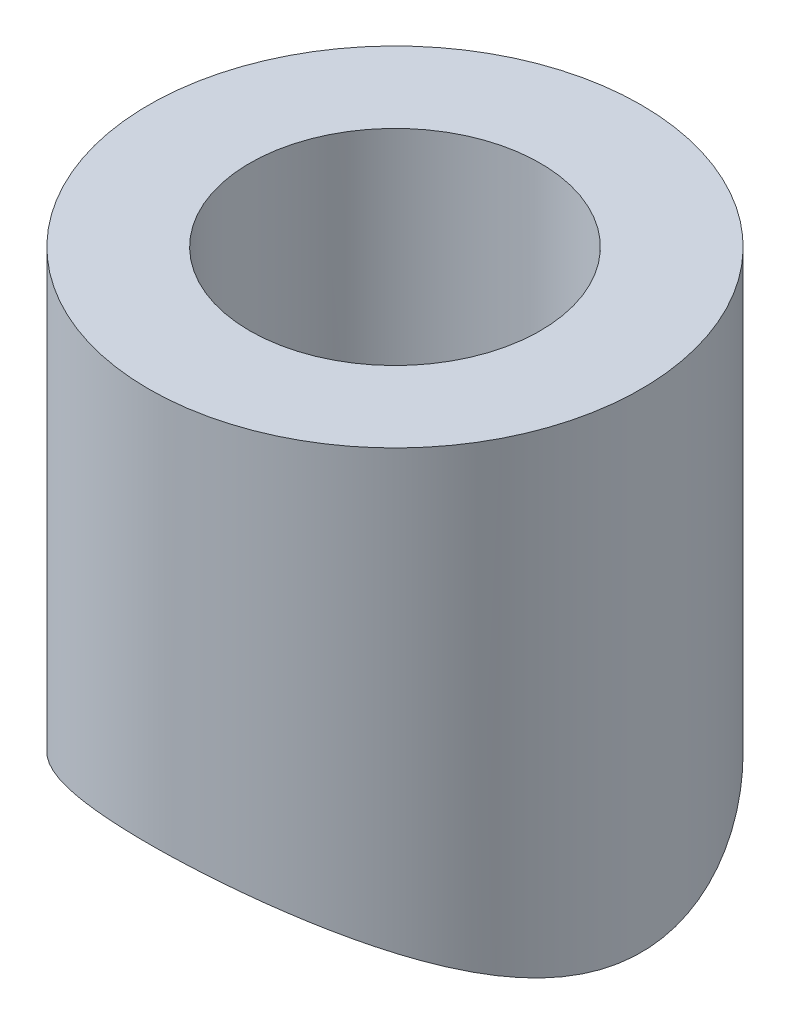
ISO-10303-21;
HEADER;
FILE_DESCRIPTION(('STEP AP214'),'2;1');
FILE_NAME('part.step','',(''),(''),'','','');
FILE_SCHEMA(('AUTOMOTIVE_DESIGN { 1 0 10303 214 1 1 1 1 }'));
ENDSEC;
DATA;
#1=APPLICATION_CONTEXT('core data for automotive mechanical design processes');
#2=APPLICATION_PROTOCOL_DEFINITION('international standard','automotive_design',2000,#1);
#3=PRODUCT_CONTEXT('',#1,'mechanical');
#4=PRODUCT('Part','Part','',(#3));
#5=PRODUCT_RELATED_PRODUCT_CATEGORY('part','',(#4));
#6=PRODUCT_DEFINITION_FORMATION('','',#4);
#7=PRODUCT_DEFINITION_CONTEXT('part definition',#1,'design');
#8=PRODUCT_DEFINITION('design','',#6,#7);
#9=PRODUCT_DEFINITION_SHAPE('','',#8);
#10=(LENGTH_UNIT() NAMED_UNIT(*) SI_UNIT(.MILLI.,.METRE.));
#11=(NAMED_UNIT(*) PLANE_ANGLE_UNIT() SI_UNIT($,.RADIAN.));
#12=(NAMED_UNIT(*) SI_UNIT($,.STERADIAN.) SOLID_ANGLE_UNIT());
#13=UNCERTAINTY_MEASURE_WITH_UNIT(LENGTH_MEASURE(1.E-05),#10,'distance_accuracy_value','');
#14=(GEOMETRIC_REPRESENTATION_CONTEXT(3) GLOBAL_UNCERTAINTY_ASSIGNED_CONTEXT((#13)) GLOBAL_UNIT_ASSIGNED_CONTEXT((#10,
#11,#12)) REPRESENTATION_CONTEXT('',''));
#15=CARTESIAN_POINT('',(0.,0.,0.));
#16=DIRECTION('',(0.,0.,1.));
#17=DIRECTION('',(1.,0.,0.));
#18=AXIS2_PLACEMENT_3D('',#15,#16,#17);
#19=CARTESIAN_POINT('',(0.,20.,0.));
#20=DIRECTION('',(0.,-1.,0.));
#21=DIRECTION('',(0.,0.,-1.));
#22=AXIS2_PLACEMENT_3D('',#19,#20,#21);
#23=CYLINDRICAL_SURFACE('',#22,10.);
#24=CARTESIAN_POINT('',(0.,20.,0.));
#25=DIRECTION('',(0.,1.,0.));
#26=DIRECTION('',(0.,0.,1.));
#27=AXIS2_PLACEMENT_3D('',#24,#25,#26);
#28=CIRCLE('',#27,10.);
#29=CARTESIAN_POINT('',(0.,20.,10.));
#30=VERTEX_POINT('',#29);
#31=EDGE_CURVE('E54',#30,#30,#28,.T.);
#32=ORIENTED_EDGE('',*,*,#31,.F.);
#33=EDGE_LOOP('',(#32));
#34=FACE_BOUND('',#33,.T.);
#35=CARTESIAN_POINT('',(0.,4.,-10.));
#36=CARTESIAN_POINT('',(0.25121602505803,3.99999993303551,-9.99999993534951));
#37=CARTESIAN_POINT('',(0.50243329641179,3.9936756382587,-9.99052094502158));
#38=CARTESIAN_POINT('',(1.00281430621742,3.96853772549104,-9.95275435405694));
#39=CARTESIAN_POINT('',(1.25197803385393,3.94972404176501,-9.92446665442466));
#40=CARTESIAN_POINT('',(1.74639437147615,3.90006260729804,-9.84950014434954));
#41=CARTESIAN_POINT('',(1.99164541802644,3.86921016554187,-9.80281416477334));
#42=CARTESIAN_POINT('',(2.47636835109205,3.7962049328406,-9.69171976038695));
#43=CARTESIAN_POINT('',(2.71584016768893,3.75405200525427,-9.62731112128079));
#44=CARTESIAN_POINT('',(3.18634157579506,3.65962256787353,-9.48196024055735));
#45=CARTESIAN_POINT('',(3.41740603302261,3.60739538358416,-9.40109845501636));
#46=CARTESIAN_POINT('',(3.87103535608821,3.49378366671374,-9.22357931716256));
#47=CARTESIAN_POINT('',(4.09360026589291,3.43239918150983,-9.12692204657064));
#48=CARTESIAN_POINT('',(4.52919238259836,3.30168244543471,-8.91878234381083));
#49=CARTESIAN_POINT('',(4.74222111188152,3.2323514695008,-8.80730228935662));
#50=CARTESIAN_POINT('',(5.15806897823306,3.08697507872304,-8.57039192321527));
#51=CARTESIAN_POINT('',(5.36088427435106,3.01092716702556,-8.44495641940083));
#52=CARTESIAN_POINT('',(5.77229179252596,2.846795493068,-8.16988010712301));
#53=CARTESIAN_POINT('',(5.97992610161555,2.75823764309107,-8.01908981242674));
#54=CARTESIAN_POINT('',(6.38186231730968,2.57646899703334,-7.70306611819707));
#55=CARTESIAN_POINT('',(6.57615840484502,2.48325620038876,-7.5378264854341));
#56=CARTESIAN_POINT('',(6.95109161684714,2.29385168898652,-7.19355182648485));
#57=CARTESIAN_POINT('',(7.13171020600086,2.19765617229715,-7.01449872097467));
#58=CARTESIAN_POINT('',(7.47849345473134,2.00428934694723,-6.6435373382512));
#59=CARTESIAN_POINT('',(7.64466276695229,1.90711836371115,-6.45163323453413));
#60=CARTESIAN_POINT('',(7.98727084465364,1.69841833217074,-6.02411381532355));
#61=CARTESIAN_POINT('',(8.16117931320375,1.58704827439665,-5.78638467561562));
#62=CARTESIAN_POINT('',(8.48824389065339,1.36884696096218,-5.29498288365453));
#63=CARTESIAN_POINT('',(8.64139528736315,1.26201673968374,-5.04130663021886));
#64=CARTESIAN_POINT('',(8.92554542356295,1.05675366786715,-4.51916377060268));
#65=CARTESIAN_POINT('',(9.05657983313836,0.958307425286978,-4.25072192372749));
#66=CARTESIAN_POINT('',(9.2953668655437,0.773655248942557,-3.6995014922921));
#67=CARTESIAN_POINT('',(9.4031186480483,0.68744975701457,-3.41672239072096));
#68=CARTESIAN_POINT('',(9.56603073076105,0.554164407183983,-2.92197512669334));
#69=CARTESIAN_POINT('',(9.62739262612926,0.502974785729807,-2.71313958691548));
#70=CARTESIAN_POINT('',(9.73672940324514,0.410575310927276,-2.28993727422301));
#71=CARTESIAN_POINT('',(9.784712881697,0.369359051155758,-2.07557415043356));
#72=CARTESIAN_POINT('',(9.86663115695275,0.298342143549268,-1.6425809785492));
#73=CARTESIAN_POINT('',(9.90058335814109,0.268527356786831,-1.42395657095979));
#74=CARTESIAN_POINT('',(9.95398099415626,0.221387591900997,-0.983588730911829));
#75=CARTESIAN_POINT('',(9.97342634948116,0.204062682225945,-0.761845281366754));
#76=CARTESIAN_POINT('',(9.99750949727822,0.182578902774177,-0.315986902566632));
#77=CARTESIAN_POINT('',(10.0020856379335,0.178474850878617,-0.0918659554353692));
#78=CARTESIAN_POINT('',(9.9961699136916,0.183765084434493,0.356015329671867));
#79=CARTESIAN_POINT('',(9.98567799761094,0.193159415737438,0.57977566642033));
#80=CARTESIAN_POINT('',(9.94981025476011,0.225054342925366,1.02531254772308));
#81=CARTESIAN_POINT('',(9.92442336863968,0.247564677211397,1.24708749379653));
#82=CARTESIAN_POINT('',(9.85920094420808,0.304779082616557,1.68688746328601));
#83=CARTESIAN_POINT('',(9.81936513033175,0.339483386294636,1.90491241510033));
#84=CARTESIAN_POINT('',(9.72793320006853,0.418001909451414,2.32630776900133));
#85=CARTESIAN_POINT('',(9.67693962238987,0.461341759139342,2.52989845513065));
#86=CARTESIAN_POINT('',(9.56290804839144,0.556656885733759,2.93162712247606));
#87=CARTESIAN_POINT('',(9.49986594811239,0.608635104246266,3.12976321936933));
#88=CARTESIAN_POINT('',(9.29354494113033,0.775450261944478,3.7149653297061));
#89=CARTESIAN_POINT('',(9.13302364641689,0.901210450348814,4.09304089571523));
#90=CARTESIAN_POINT('',(8.84272153741117,1.11712851273462,4.67614375859801));
#91=CARTESIAN_POINT('',(8.72612786560377,1.2015387549069,4.89016265101236));
#92=CARTESIAN_POINT('',(8.47852404512044,1.37487173625424,5.30787405322557));
#93=CARTESIAN_POINT('',(8.34751253601214,1.46379490083046,5.51156558590632));
#94=CARTESIAN_POINT('',(8.07152743445186,1.6442740511078,5.90837865949047));
#95=CARTESIAN_POINT('',(7.92653854045352,1.73583284345222,6.10148824490793));
#96=CARTESIAN_POINT('',(7.62317723911379,1.91969948733064,6.47652189877409));
#97=CARTESIAN_POINT('',(7.46480412146615,2.01200737838432,6.658445372685));
#98=CARTESIAN_POINT('',(7.09947419488299,2.21552488661668,7.04865159805946));
#99=CARTESIAN_POINT('',(6.88940798266188,2.32651519777505,7.25415168380683));
#100=CARTESIAN_POINT('',(6.45073383646428,2.54429826686849,7.64687567157477));
#101=CARTESIAN_POINT('',(6.22212250338513,2.65109024994987,7.83409620924893));
#102=CARTESIAN_POINT('',(5.74734305844846,2.85767006749272,8.18875916118422));
#103=CARTESIAN_POINT('',(5.50118802469018,2.95746301158379,8.35621606611875));
#104=CARTESIAN_POINT('',(4.99223677264768,3.14748381365506,8.6698826076979));
#105=CARTESIAN_POINT('',(4.72944516189957,3.23771430162669,8.81609809055921));
#106=CARTESIAN_POINT('',(4.24166531219499,3.38958461571668,9.05909913410104));
#107=CARTESIAN_POINT('',(4.01936273392654,3.45336194634127,9.15995597951621));
#108=CARTESIAN_POINT('',(3.5659086899693,3.57186255644632,9.34581764481726));
#109=CARTESIAN_POINT('',(3.3347588978084,3.62658753793695,9.43082544500166));
#110=CARTESIAN_POINT('',(2.86496136705682,3.72581387463809,9.58399689634911));
#111=CARTESIAN_POINT('',(2.6263185086893,3.77032173343263,9.65217126472845));
#112=CARTESIAN_POINT('',(2.14287716114343,3.8481652748998,9.7708761960258));
#113=CARTESIAN_POINT('',(1.89807857733481,3.88150078570999,9.82140648752831));
#114=CARTESIAN_POINT('',(1.40298657198256,3.93632894740972,9.90428665687823));
#115=CARTESIAN_POINT('',(1.15267379959939,3.95776916030985,9.9365560475488));
#116=CARTESIAN_POINT('',(0.649559957245918,3.98804780109095,9.98207727619356));
#117=CARTESIAN_POINT('',(0.396758884024645,3.99688621250542,9.99532908931791));
#118=CARTESIAN_POINT('',(-0.10923236811486,4.00173589757922,10.0026040164575));
#119=CARTESIAN_POINT('',(-0.36242253056564,3.99774769992631,9.99662792300954));
#120=CARTESIAN_POINT('',(-0.86709078423296,3.97704666149022,9.96554372761836));
#121=CARTESIAN_POINT('',(-1.11856894805903,3.96033436379857,9.94043644223491));
#122=CARTESIAN_POINT('',(-1.60021088099168,3.91622072567469,9.8739156350187));
#123=CARTESIAN_POINT('',(-1.83062905444838,3.88965450331535,9.83377417424126));
#124=CARTESIAN_POINT('',(-2.286750791688,3.82645532288706,9.73781705393653));
#125=CARTESIAN_POINT('',(-2.51245462006972,3.78982293143753,9.6820022766482));
#126=CARTESIAN_POINT('',(-2.95782054801539,3.70722928723845,9.55535953808213));
#127=CARTESIAN_POINT('',(-3.17748326843354,3.66126899723065,9.48453312613683));
#128=CARTESIAN_POINT('',(-3.609760336539,3.56086857449814,9.3285826248577));
#129=CARTESIAN_POINT('',(-3.82237190283185,3.50642514265643,9.24345297194153));
#130=CARTESIAN_POINT('',(-4.25209030381565,3.38653644685778,9.05417659982018));
#131=CARTESIAN_POINT('',(-4.4686990221519,3.32062655384653,8.94919430778672));
#132=CARTESIAN_POINT('',(-4.89208194000024,3.18158002382276,8.72496139473395));
#133=CARTESIAN_POINT('',(-5.0988519722715,3.10844036425447,8.60570480161194));
#134=CARTESIAN_POINT('',(-5.50184549515242,2.95622092378315,8.35381209040239));
#135=CARTESIAN_POINT('',(-5.69806630986326,2.87713964782103,8.2211726019456));
#136=CARTESIAN_POINT('',(-6.07939950359023,2.71436808581636,7.94333478354166));
#137=CARTESIAN_POINT('',(-6.26451064052812,2.63067728642082,7.79813505375508));
#138=CARTESIAN_POINT('',(-6.65160325692351,2.44652690823113,7.47194619721016));
#139=CARTESIAN_POINT('',(-6.85161533719512,2.34551033202061,7.28893046890855));
#140=CARTESIAN_POINT('',(-7.23554778501399,2.14131347092371,6.90796479617464));
#141=CARTESIAN_POINT('',(-7.41947156934853,2.03813365125963,6.71001803946436));
#142=CARTESIAN_POINT('',(-7.77089399542675,1.83178699091403,6.29970117597319));
#143=CARTESIAN_POINT('',(-7.93837850837233,1.72862023620127,6.08731892329163));
#144=CARTESIAN_POINT('',(-8.25611378856013,1.52486307300481,5.64888230394208));
#145=CARTESIAN_POINT('',(-8.406366316081,1.42427240218627,5.42282933737188));
#146=CARTESIAN_POINT('',(-8.67693135617692,1.23665115187757,4.97724137462276));
#147=CARTESIAN_POINT('',(-8.798701217252,1.14919318294131,4.75877148537544));
#148=CARTESIAN_POINT('',(-9.02642731767801,0.980970362239639,4.31122260025005));
#149=CARTESIAN_POINT('',(-9.13238332794099,0.900205607443256,4.08214345074349));
#150=CARTESIAN_POINT('',(-9.32741855584938,0.747959531107767,3.61433071357679));
#151=CARTESIAN_POINT('',(-9.4165224648861,0.676464676577637,3.37561188246709));
#152=CARTESIAN_POINT('',(-9.57697422267288,0.545229567701584,2.88913740218876));
#153=CARTESIAN_POINT('',(-9.64832615207156,0.48548661260812,2.64138384487466));
#154=CARTESIAN_POINT('',(-9.76102279918068,0.389770483143118,2.18348283637983));
#155=CARTESIAN_POINT('',(-9.80545611371607,0.35145489156227,1.97458281771767));
#156=CARTESIAN_POINT('',(-9.88104071134551,0.285723439317099,1.55271682450731));
#157=CARTESIAN_POINT('',(-9.91219468486488,0.258305370865387,1.33975168270624));
#158=CARTESIAN_POINT('',(-9.96072687389686,0.21539011314292,0.911245598990397));
#159=CARTESIAN_POINT('',(-9.97811721936676,0.19988242754709,0.695707095456911));
#160=CARTESIAN_POINT('',(-9.99887192737887,0.18135758848689,0.26340949324988));
#161=CARTESIAN_POINT('',(-10.0022360852241,0.178340617310944,0.046650376809043));
#162=CARTESIAN_POINT('',(-9.99487528285886,0.184922492776818,-0.386557642145756));
#163=CARTESIAN_POINT('',(-9.98414227971974,0.194528541299066,-0.603006296976088));
#164=CARTESIAN_POINT('',(-9.94876260555887,0.22598222127615,-1.03385131272256));
#165=CARTESIAN_POINT('',(-9.92411604859886,0.247829752376686,-1.24824769044838));
#166=CARTESIAN_POINT('',(-9.86128176273312,0.302958114871752,-1.67374366731717));
#167=CARTESIAN_POINT('',(-9.82308162817279,0.336249419934558,-1.88484006053562));
#168=CARTESIAN_POINT('',(-9.73367199559206,0.413110740350625,-2.30244876806635));
#169=CARTESIAN_POINT('',(-9.68245505594956,0.456686634315685,-2.50895838646712));
#170=CARTESIAN_POINT('',(-9.55234495109753,0.565538826753452,-2.97060688179122));
#171=CARTESIAN_POINT('',(-9.46971376976683,0.633504015642252,-3.22406270379323));
#172=CARTESIAN_POINT('',(-9.28581809630263,0.780808368451346,-3.72072127097187));
#173=CARTESIAN_POINT('',(-9.18454717174898,0.86015145669565,-3.96392044094322));
#174=CARTESIAN_POINT('',(-8.96438401317387,1.02742474627637,-4.43942989824263));
#175=CARTESIAN_POINT('',(-8.84547355124955,1.1153637978473,-4.67172859070883));
#176=CARTESIAN_POINT('',(-8.59104253624864,1.29709012912716,-5.12459249071148));
#177=CARTESIAN_POINT('',(-8.45552286037769,1.39087709985336,-5.34515831703064));
#178=CARTESIAN_POINT('',(-8.16602291524329,1.58359437791119,-5.7779814169915));
#179=CARTESIAN_POINT('',(-8.01175463180858,1.68258683037286,-5.99001811350071));
#180=CARTESIAN_POINT('',(-7.68731964794005,1.88182332846335,-6.40107008606171));
#181=CARTESIAN_POINT('',(-7.51714699045039,1.98206783077517,-6.60008043519651));
#182=CARTESIAN_POINT('',(-7.16144037138928,2.18162978751133,-6.98443549509661));
#183=CARTESIAN_POINT('',(-6.97590419669871,2.28094710607369,-7.16977822974279));
#184=CARTESIAN_POINT('',(-6.58999024940345,2.47660337742725,-7.5260207576439));
#185=CARTESIAN_POINT('',(-6.38961262683214,2.57294236031274,-7.69692069686481));
#186=CARTESIAN_POINT('',(-5.94464767383283,2.77421637055963,-8.04688641781006));
#187=CARTESIAN_POINT('',(-5.69784749774642,2.87839392663557,-8.22358940998542));
#188=CARTESIAN_POINT('',(-5.18647351593625,3.07749196651132,-8.55531270154688));
#189=CARTESIAN_POINT('',(-4.92189712727176,3.17241110009859,-8.71032983977895));
#190=CARTESIAN_POINT('',(-4.37672916893082,3.3501334769257,-8.99660521889808));
#191=CARTESIAN_POINT('',(-4.09615781925748,3.43295156539963,-9.12789261847726));
#192=CARTESIAN_POINT('',(-3.52068543509657,3.58400380388435,-9.36490865379198));
#193=CARTESIAN_POINT('',(-3.22578947664134,3.65224307439965,-9.47064626507089));
#194=CARTESIAN_POINT('',(-2.69111020627909,3.7585526216257,-9.63420014250047));
#195=CARTESIAN_POINT('',(-2.45363501782301,3.79995729353856,-9.69744389486791));
#196=CARTESIAN_POINT('',(-1.97308581148122,3.87164769700839,-9.8065080818939));
#197=CARTESIAN_POINT('',(-1.73001287618556,3.90193555965206,-9.85233185601367));
#198=CARTESIAN_POINT('',(-1.24011776126904,3.95067444418079,-9.92589668010659));
#199=CARTESIAN_POINT('',(-0.993297927604442,3.96913258326322,-9.95364860293288));
#200=CARTESIAN_POINT('',(-0.497652520116127,3.99379562414303,-9.9907006409564));
#201=CARTESIAN_POINT('',(-0.248826871409575,4.00000006632763,-10.0000000640356));
#202=CARTESIAN_POINT('',(0.,4.,-10.));
#203=B_SPLINE_CURVE_WITH_KNOTS('',3,(#35,#36,#37,#38,#39,#40,#41,#42,#43,#44,#45,#46,#47,#48,
#49,#50,#51,#52,#53,#54,#55,#56,#57,#58,#59,#60,#61,#62,#63,#64,#65,#66,#67,#68,#69,#70,#71,#72,
#73,#74,#75,#76,#77,#78,#79,#80,#81,#82,#83,#84,#85,#86,#87,#88,#89,#90,#91,#92,#93,#94,#95,#96,
#97,#98,#99,#100,#101,#102,#103,#104,#105,#106,#107,#108,#109,#110,#111,#112,#113,#114,#115,
#116,#117,#118,#119,#120,#121,#122,#123,#124,#125,#126,#127,#128,#129,#130,#131,#132,#133,#134,
#135,#136,#137,#138,#139,#140,#141,#142,#143,#144,#145,#146,#147,#148,#149,#150,#151,#152,#153,
#154,#155,#156,#157,#158,#159,#160,#161,#162,#163,#164,#165,#166,#167,#168,#169,#170,#171,#172,
#173,#174,#175,#176,#177,#178,#179,#180,#181,#182,#183,#184,#185,#186,#187,#188,#189,#190,#191,
#192,#193,#194,#195,#196,#197,#198,#199,#200,#201,#202),.UNSPECIFIED.,.T.,.F.,(4,2,2,2,2,2,2,2,
2,2,2,2,2,2,2,2,2,2,2,2,2,2,2,2,2,2,2,2,2,2,2,2,2,2,2,2,2,2,2,2,2,2,2,2,2,2,2,2,2,2,2,2,2,2,2,2,
2,2,2,2,2,2,2,2,2,2,2,2,2,2,2,2,2,2,2,2,2,2,2,2,2,2,2,4),(0.,0.753394300185717,1.50679256573076,
2.2604846936234,3.0141859352887,3.76428651453101,4.51438321311105,5.26435973397233,
6.01461622276406,6.82821436912434,7.64216523759396,8.45720010773051,9.27197155852477,
10.2155659725767,11.159374240242,12.1016454881405,13.0439507391687,13.7141436311146,
14.3839048726875,15.0528328312319,15.7217644556782,16.3934661372619,17.0651701004973,
17.7373734287591,18.4095895777342,19.0518780381327,19.694385665547,20.9787317460437,
21.7519790573574,22.5252993930816,23.2994761376386,24.0736939939054,25.0149715434142,
25.956422009544,26.8971778596539,27.8376742956463,28.5938374823541,29.3498583343056,
30.1053966077373,30.8609465029599,31.6198011453589,32.3786567793353,33.1374811351664,
33.896273104583,34.6016588818499,35.3070049614494,36.0122782785612,36.7178265661456,
37.4657892549015,38.2140659784521,38.9625316217945,39.7110807894034,40.5781485096025,
41.4450316350127,42.3126534000335,43.1801864568224,43.9743636862577,44.7685524194551,
45.5615683509502,46.3544018230503,47.0046896349387,47.6548456343111,48.3044280077778,
48.9540198611609,49.6039824906945,50.2539397919853,50.9044935435747,51.5554200523821,
52.3795636043219,53.203992096394,54.0292785280237,54.8545213914148,55.6945962643172,
56.534987061841,57.3754991292032,58.2160027009215,59.1774341078251,60.1390055171883,
61.0993872102032,62.0594310326874,62.8062251677098,63.5528760678118,64.2990773324883,
65.045306585219),.UNSPECIFIED.);
#204=CARTESIAN_POINT('',(0.,4.,-10.));
#205=VERTEX_POINT('',#204);
#206=EDGE_CURVE('E10',#205,#205,#203,.T.);
#207=ORIENTED_EDGE('',*,*,#206,.F.);
#208=EDGE_LOOP('',(#207));
#209=FACE_BOUND('',#208,.T.);
#210=ADVANCED_FACE('F40',(#34,#209),#23,.T.);
#211=CARTESIAN_POINT('',(0.,20.,0.));
#212=DIRECTION('',(0.,1.,0.));
#213=DIRECTION('',(0.,0.,1.));
#214=AXIS2_PLACEMENT_3D('',#211,#212,#213);
#215=PLANE('',#214);
#216=CARTESIAN_POINT('',(0.,20.,0.));
#217=DIRECTION('',(0.,1.,0.));
#218=DIRECTION('',(0.,0.,1.));
#219=AXIS2_PLACEMENT_3D('',#216,#217,#218);
#220=CIRCLE('',#219,5.89999999999999);
#221=CARTESIAN_POINT('',(0.,20.,5.89999999999999));
#222=VERTEX_POINT('',#221);
#223=EDGE_CURVE('E82',#222,#222,#220,.T.);
#224=ORIENTED_EDGE('',*,*,#223,.F.);
#225=EDGE_LOOP('',(#224));
#226=FACE_BOUND('',#225,.T.);
#227=ORIENTED_EDGE('',*,*,#31,.T.);
#228=EDGE_LOOP('',(#227));
#229=FACE_BOUND('',#228,.T.);
#230=ADVANCED_FACE('F68',(#226,#229),#215,.T.);
#231=CARTESIAN_POINT('',(0.,-11.,10.));
#232=DIRECTION('',(0.,0.,-1.));
#233=DIRECTION('',(-1.,0.,0.));
#234=AXIS2_PLACEMENT_3D('',#231,#232,#233);
#235=CYLINDRICAL_SURFACE('',#234,15.);
#236=CARTESIAN_POINT('',(0.,4.,5.89999999999999));
#237=CARTESIAN_POINT('',(-0.15886402470859,3.99999913625232,5.8999988863144));
#238=CARTESIAN_POINT('',(-0.317779950355858,3.99746931305863,5.89357520474754));
#239=CARTESIAN_POINT('',(-0.634487192558133,3.9874133333307,5.86793776395059));
#240=CARTESIAN_POINT('',(-0.792277747875371,3.97988406911607,5.84871604937163));
#241=CARTESIAN_POINT('',(-1.10582108289662,3.96000940030454,5.79762332906444));
#242=CARTESIAN_POINT('',(-1.26156911964243,3.94765432860217,5.76572693104519));
#243=CARTESIAN_POINT('',(-1.56964700780746,3.9184504600687,5.68958691217239));
#244=CARTESIAN_POINT('',(-1.72197544560173,3.90159984060818,5.64533828301715));
#245=CARTESIAN_POINT('',(-2.02158668581309,3.86391280156689,5.54509257957201));
#246=CARTESIAN_POINT('',(-2.16888563475883,3.84309090394318,5.48913824002966));
#247=CARTESIAN_POINT('',(-2.45813869164274,3.79793886714942,5.36584429748198));
#248=CARTESIAN_POINT('',(-2.60009078044859,3.77360741909241,5.29850044513351));
#249=CARTESIAN_POINT('',(-2.87766944043755,3.72205570263508,5.15301346366749));
#250=CARTESIAN_POINT('',(-3.01330054724605,3.69483755300188,5.07487824258846));
#251=CARTESIAN_POINT('',(-3.27762075907118,3.63815256297203,4.90832310456473));
#252=CARTESIAN_POINT('',(-3.40630732890181,3.6086849107206,4.8198994683958));
#253=CARTESIAN_POINT('',(-3.79122224674704,3.51544087743521,4.53231426875867));
#254=CARTESIAN_POINT('',(-4.03487542005891,3.44902511642504,4.31681064559096));
#255=CARTESIAN_POINT('',(-4.48363241461597,3.31614521950365,3.84866694646856));
#256=CARTESIAN_POINT('',(-4.68871849815152,3.24968107537836,3.59600987769273));
#257=CARTESIAN_POINT('',(-4.96750285069997,3.15394446782774,3.18789782875035));
#258=CARTESIAN_POINT('',(-5.05714283824389,3.12208150221224,3.04371452529704));
#259=CARTESIAN_POINT('',(-5.22387669173731,3.06125821169838,2.74771340313458));
#260=CARTESIAN_POINT('',(-5.30097570422339,3.03229669799253,2.59589874981333));
#261=CARTESIAN_POINT('',(-5.44197901115005,2.97821782892189,2.28558913674227));
#262=CARTESIAN_POINT('',(-5.50588224456501,2.95310078271902,2.12709364104254));
#263=CARTESIAN_POINT('',(-5.61983836008169,2.90759448914051,1.80461604333882));
#264=CARTESIAN_POINT('',(-5.66989811023419,2.88720289818108,1.6406367074143));
#265=CARTESIAN_POINT('',(-5.75377705769864,2.85265380017551,1.31566197136275));
#266=CARTESIAN_POINT('',(-5.78821121044726,2.8382624894147,1.15485012917211));
#267=CARTESIAN_POINT('',(-5.84355691082952,2.81498271579644,0.830589464875498));
#268=CARTESIAN_POINT('',(-5.86447451170366,2.80609178972773,0.667141856829423));
#269=CARTESIAN_POINT('',(-5.89256180921693,2.79412735701231,0.338888435645067));
#270=CARTESIAN_POINT('',(-5.89973418068685,2.79105271851367,0.174082893032172));
#271=CARTESIAN_POINT('',(-5.90025126583926,2.79083161646126,-0.155550163954016));
#272=CARTESIAN_POINT('',(-5.89359659374709,2.79368488957762,-0.320377677026099));
#273=CARTESIAN_POINT('',(-5.86745354897625,2.80482415567381,-0.637652170168301));
#274=CARTESIAN_POINT('',(-5.84885735830678,2.81273230955767,-0.790186996663247));
#275=CARTESIAN_POINT('',(-5.79989039834442,2.8333646248671,-1.09307498826591));
#276=CARTESIAN_POINT('',(-5.76951574408652,2.84609037527806,-1.24342741654671));
#277=CARTESIAN_POINT('',(-5.69729551133463,2.87596293312977,-1.5408569857585));
#278=CARTESIAN_POINT('',(-5.65545274779607,2.89310865558548,-1.68793492087812));
#279=CARTESIAN_POINT('',(-5.56064974739785,2.93132386008433,-1.97799535969655));
#280=CARTESIAN_POINT('',(-5.50768524337297,2.95239484781353,-2.12097626745802));
#281=CARTESIAN_POINT('',(-5.38993241709986,2.99831052320604,-2.40472127782506));
#282=CARTESIAN_POINT('',(-5.32493240680503,3.0232211678615,-2.54538677220291));
#283=CARTESIAN_POINT('',(-5.18429832328865,3.07581919764985,-2.82081015539261));
#284=CARTESIAN_POINT('',(-5.10866064550753,3.10350752308067,-2.95556602134616));
#285=CARTESIAN_POINT('',(-4.94726662477955,3.16092819984799,-3.21843808743218));
#286=CARTESIAN_POINT('',(-4.86150898415206,3.19066081311863,-3.34655343301407));
#287=CARTESIAN_POINT('',(-4.68039973214116,3.25142030010385,-3.595490794026));
#288=CARTESIAN_POINT('',(-4.58504764237444,3.28244723830882,-3.71631244530831));
#289=CARTESIAN_POINT('',(-4.3778024297688,3.34738648969097,-3.95880647418091));
#290=CARTESIAN_POINT('',(-4.26520560660479,3.38134108601129,-4.07986701444259));
#291=CARTESIAN_POINT('',(-4.03024679024003,3.44894627875407,-4.31212139911646));
#292=CARTESIAN_POINT('',(-3.90788770986757,3.48259696254562,-4.4233181658894));
#293=CARTESIAN_POINT('',(-3.65400475228751,3.54872719593226,-4.63525690958083));
#294=CARTESIAN_POINT('',(-3.52247574699305,3.58120607456291,-4.73599295689648));
#295=CARTESIAN_POINT('',(-3.2511304652065,3.64409561571205,-4.92621480773481));
#296=CARTESIAN_POINT('',(-3.11131753045877,3.67450710172957,-5.01570510294469));
#297=CARTESIAN_POINT('',(-2.82145635598018,3.73301237186477,-5.18440293141563));
#298=CARTESIAN_POINT('',(-2.67126392162488,3.76105100238213,-5.26338223976571));
#299=CARTESIAN_POINT('',(-2.36414612855485,3.81334071806329,-5.40829268185492));
#300=CARTESIAN_POINT('',(-2.2072234993306,3.83759332051084,-5.47422904551266));
#301=CARTESIAN_POINT('',(-1.8877337615166,3.88161469515253,-5.59244728656685));
#302=CARTESIAN_POINT('',(-1.72516770706421,3.90138429958614,-5.64473169863293));
#303=CARTESIAN_POINT('',(-1.39561339752138,3.93585292671384,-5.7351068458267));
#304=CARTESIAN_POINT('',(-1.2286254379793,3.95055228737306,-5.77319852700692));
#305=CARTESIAN_POINT('',(-0.901300765008888,3.97374400142506,-5.83298565897697));
#306=CARTESIAN_POINT('',(-0.74113496353724,3.98254510868229,-5.8554991514441));
#307=CARTESIAN_POINT('',(-0.419299518258383,3.99500302010952,-5.88730255061081));
#308=CARTESIAN_POINT('',(-0.257629945792265,3.99866006708086,-5.8965930814388));
#309=CARTESIAN_POINT('',(0.0659239641503538,4.00072740695533,-5.90184956228925));
#310=CARTESIAN_POINT('',(0.227808248681544,3.99913881476464,-5.89781834371118));
#311=CARTESIAN_POINT('',(0.550561760634162,3.99076182076037,-5.87648164094379));
#312=CARTESIAN_POINT('',(0.711431006321447,3.98397351278749,-5.85917639631444));
#313=CARTESIAN_POINT('',(1.02398174081835,3.96579092992752,-5.81251548539859));
#314=CARTESIAN_POINT('',(1.17575901931427,3.95460928804992,-5.78371526686284));
#315=CARTESIAN_POINT('',(1.47627933170729,3.92793900669011,-5.71440164797086));
#316=CARTESIAN_POINT('',(1.62502135378546,3.91244895536182,-5.67388440782705));
#317=CARTESIAN_POINT('',(1.91841980360293,3.87754978203588,-5.58151539700504));
#318=CARTESIAN_POINT('',(2.06307734676172,3.85814174202432,-5.5296667552645));
#319=CARTESIAN_POINT('',(2.3475293157707,3.81586285583965,-5.41503739209104));
#320=CARTESIAN_POINT('',(2.48732186831017,3.79299069352603,-5.35225251423529));
#321=CARTESIAN_POINT('',(2.76529996156236,3.74359647040171,-5.21420312979319));
#322=CARTESIAN_POINT('',(2.90331206301826,3.71698563094202,-5.13862125080068));
#323=CARTESIAN_POINT('',(3.1725479442987,3.66130440058902,-4.9769076615116));
#324=CARTESIAN_POINT('',(3.30376937428445,3.63223316735334,-4.89077233357272));
#325=CARTESIAN_POINT('',(3.55869694740015,3.57233079081368,-4.70852743178479));
#326=CARTESIAN_POINT('',(3.68240185604492,3.54149936002558,-4.61241622651734));
#327=CARTESIAN_POINT('',(3.92163712638682,3.47881406272616,-4.41080887063424));
#328=CARTESIAN_POINT('',(4.03716714736857,3.44696015368001,-4.30531232926693));
#329=CARTESIAN_POINT('',(4.26658437816332,3.3809389304766,-4.07847027669607));
#330=CARTESIAN_POINT('',(4.37989143866896,3.34675422530451,-3.9565422899972));
#331=CARTESIAN_POINT('',(4.5958488917381,3.2790398339185,-3.70348940204712));
#332=CARTESIAN_POINT('',(4.69850261993577,3.24550994536247,-3.5723674011849));
#333=CARTESIAN_POINT('',(4.89258424450002,3.18002527887828,-3.3015727183022));
#334=CARTESIAN_POINT('',(4.98400592990807,3.14807137821386,-3.16189536884691));
#335=CARTESIAN_POINT('',(5.15486352372169,3.08671791093294,-2.87493543946249));
#336=CARTESIAN_POINT('',(5.23430447280632,3.05731727229825,-2.7276560931417));
#337=CARTESIAN_POINT('',(5.38123297728264,3.00173412247333,-2.42504869838527));
#338=CARTESIAN_POINT('',(5.44861206992979,2.97558140241288,-2.26966241167919));
#339=CARTESIAN_POINT('',(5.56991675414551,2.92768045987602,-1.95313554235444));
#340=CARTESIAN_POINT('',(5.62384807183518,2.90593036348838,-1.79199744240992));
#341=CARTESIAN_POINT('',(5.71771175111956,2.86760057478817,-1.46515173862492));
#342=CARTESIAN_POINT('',(5.75764929470384,2.85101896880021,-1.29944585083875));
#343=CARTESIAN_POINT('',(5.82308739215896,2.82363618341523,-0.964740049340421));
#344=CARTESIAN_POINT('',(5.84858909825645,2.81283454268193,-0.795740399640902));
#345=CARTESIAN_POINT('',(5.88357376361006,2.79796691490081,-0.467785167163879));
#346=CARTESIAN_POINT('',(5.89405259339686,2.79348256296567,-0.30895406956344));
#347=CARTESIAN_POINT('',(5.90213677155207,2.79002548953713,0.00909332434482105));
#348=CARTESIAN_POINT('',(5.89974263395456,2.79105254796603,0.168309605018024));
#349=CARTESIAN_POINT('',(5.88210947306976,2.79858247913382,0.485877622116308));
#350=CARTESIAN_POINT('',(5.86687191409091,2.80508472763342,0.644229455027703));
#351=CARTESIAN_POINT('',(5.82372336852143,2.82334233475248,0.958886865820264));
#352=CARTESIAN_POINT('',(5.79581242538134,2.83509767536177,1.11519245071508));
#353=CARTESIAN_POINT('',(5.72888417116043,2.86294143662405,1.41885627622029));
#354=CARTESIAN_POINT('',(5.69031916273929,2.87885219318166,1.56633094979512));
#355=CARTESIAN_POINT('',(5.6020548303853,2.91471342193647,1.85745198782569));
#356=CARTESIAN_POINT('',(5.55235188181608,2.93466520900848,2.00109708895126));
#357=CARTESIAN_POINT('',(5.44223227702502,2.97804012766463,2.28365718371234));
#358=CARTESIAN_POINT('',(5.38181714623284,3.00146276491696,2.42257284747337));
#359=CARTESIAN_POINT('',(5.25071909517207,3.0511516065686,2.69496299456908));
#360=CARTESIAN_POINT('',(5.18003244943961,3.07741884181525,2.82843548108031));
#361=CARTESIAN_POINT('',(4.94484550847827,3.16253226189244,3.23413442861455));
#362=CARTESIAN_POINT('',(4.76330508284664,3.2251772184476,3.49592633990205));
#363=CARTESIAN_POINT('',(4.36096920929989,3.35361944153009,3.98656112619462));
#364=CARTESIAN_POINT('',(4.1401600979792,3.41941779943257,4.21539248236493));
#365=CARTESIAN_POINT('',(3.77595144800067,3.51755466131953,4.53658846743406));
#366=CARTESIAN_POINT('',(3.64474588214718,3.55112808147482,4.64266437818577));
#367=CARTESIAN_POINT('',(3.37344432257107,3.61640534650458,4.84337833040323));
#368=CARTESIAN_POINT('',(3.23335136744808,3.64810982329481,4.93802024935145));
#369=CARTESIAN_POINT('',(2.94506470169647,3.70878331763606,5.11519689192427));
#370=CARTESIAN_POINT('',(2.79686752109414,3.73775114873181,5.19772637278361));
#371=CARTESIAN_POINT('',(2.49339590979872,3.79211699921996,5.34993274355419));
#372=CARTESIAN_POINT('',(2.33812243081987,3.81751549679818,5.41961135549571));
#373=CARTESIAN_POINT('',(2.03501964462394,3.86203658055256,5.54012570944491));
#374=CARTESIAN_POINT('',(1.88767712593654,3.88150887599824,5.5920588134775));
#375=CARTESIAN_POINT('',(1.58889800554787,3.91636731270966,5.68417395090935));
#376=CARTESIAN_POINT('',(1.43746183811105,3.93175388553936,5.72435722545711));
#377=CARTESIAN_POINT('',(1.13186873444755,3.95801929171505,5.79252345166369));
#378=CARTESIAN_POINT('',(0.977719121011152,3.9689087528786,5.82053517606187));
#379=CARTESIAN_POINT('',(0.667485239214535,3.98594565572172,5.86421140380166));
#380=CARTESIAN_POINT('',(0.51140217535324,3.99209591238274,5.87988323688361));
#381=CARTESIAN_POINT('',(0.29585767824856,3.99719871362605,5.89287497912132));
#382=CARTESIAN_POINT('',(0.236726516667204,3.99824859892422,5.89554609793136));
#383=CARTESIAN_POINT('',(0.118399308241981,3.99964942157911,5.89910886304574));
#384=CARTESIAN_POINT('',(0.0592032581253761,4.0000003218896,5.90000041503301));
#385=CARTESIAN_POINT('',(0.,4.,5.89999999999999));
#386=B_SPLINE_CURVE_WITH_KNOTS('',3,(#236,#237,#238,#239,#240,#241,#242,#243,#244,#245,#246,
#247,#248,#249,#250,#251,#252,#253,#254,#255,#256,#257,#258,#259,#260,#261,#262,#263,#264,#265,
#266,#267,#268,#269,#270,#271,#272,#273,#274,#275,#276,#277,#278,#279,#280,#281,#282,#283,#284,
#285,#286,#287,#288,#289,#290,#291,#292,#293,#294,#295,#296,#297,#298,#299,#300,#301,#302,#303,
#304,#305,#306,#307,#308,#309,#310,#311,#312,#313,#314,#315,#316,#317,#318,#319,#320,#321,#322,
#323,#324,#325,#326,#327,#328,#329,#330,#331,#332,#333,#334,#335,#336,#337,#338,#339,#340,#341,
#342,#343,#344,#345,#346,#347,#348,#349,#350,#351,#352,#353,#354,#355,#356,#357,#358,#359,#360,
#361,#362,#363,#364,#365,#366,#367,#368,#369,#370,#371,#372,#373,#374,#375,#376,#377,#378,#379,
#380,#381,#382,#383,#384,#385),.UNSPECIFIED.,.T.,.F.,(4,2,2,2,2,2,2,2,2,2,2,2,2,2,2,2,2,2,2,2,2,
2,2,2,2,2,2,2,2,2,2,2,2,2,2,2,2,2,2,2,2,2,2,2,2,2,2,2,2,2,2,2,2,2,2,2,2,2,2,2,2,2,2,2,2,2,2,2,2,
2,2,2,2,2,4),(0.,0.476532845562225,0.953362184245601,1.43115165186195,1.90913512476067,
2.38540313023236,2.86184922136482,3.33794800181358,3.81421942809142,4.80556058535532,
5.7973565693937,6.31503162945556,6.83249370829695,7.34999737823433,7.8672438409335,
8.3618499219887,8.85623434530219,9.35052255130524,9.84478880049233,10.3058509467905,
10.7670652976592,11.2281665403552,11.6894450216884,12.1597781947648,12.6302711253258,
13.1008244527857,13.5714012538712,14.077162707967,14.582773815072,15.0886699783671,
15.5943634341077,16.1096852547741,16.6248000225971,17.1398190842762,17.6548038099069,
18.1401255069907,18.6254242959607,19.110619946348,19.5958068404828,20.059941492906,
20.5242284196915,20.9883873046392,21.4527229841326,21.930961561456,22.4093645364275,
22.8878458713039,23.3663471367346,23.875524817536,24.3845425871042,24.8938405722504,
25.4029236780433,25.9163767991772,26.4296109149509,26.9426547752899,27.455657680181,
27.932770300575,28.4098638693922,28.8869030510144,29.3639405971261,29.8232134773823,
30.2826360371075,30.7419932268855,31.2015174426579,32.1711135694751,33.1410477263938,
33.6566091642773,34.1719952718405,34.6876038060942,35.2031431979689,35.6749245796736,
36.1466561085308,36.6172663467631,37.0875968371095,37.2651751275968,37.4427628294871),.UNSPECIFIED.);
#387=CARTESIAN_POINT('',(0.,4.,5.89999999999999));
#388=VERTEX_POINT('',#387);
#389=EDGE_CURVE('E44',#388,#388,#386,.T.);
#390=ORIENTED_EDGE('',*,*,#389,.F.);
#391=EDGE_LOOP('',(#390));
#392=FACE_BOUND('',#391,.T.);
#393=ORIENTED_EDGE('',*,*,#206,.T.);
#394=EDGE_LOOP('',(#393));
#395=FACE_BOUND('',#394,.T.);
#396=ADVANCED_FACE('F64',(#392,#395),#235,.F.);
#397=CARTESIAN_POINT('',(0.,20.,0.));
#398=DIRECTION('',(0.,1.,0.));
#399=DIRECTION('',(0.,0.,1.));
#400=AXIS2_PLACEMENT_3D('',#397,#398,#399);
#401=CYLINDRICAL_SURFACE('',#400,5.89999999999999);
#402=ORIENTED_EDGE('',*,*,#389,.T.);
#403=EDGE_LOOP('',(#402));
#404=FACE_BOUND('',#403,.T.);
#405=ORIENTED_EDGE('',*,*,#223,.T.);
#406=EDGE_LOOP('',(#405));
#407=FACE_BOUND('',#406,.T.);
#408=ADVANCED_FACE('F67',(#404,#407),#401,.F.);
#409=CLOSED_SHELL('',(#210,#230,#396,#408));
#410=MANIFOLD_SOLID_BREP('B2',#409);
#411=ADVANCED_BREP_SHAPE_REPRESENTATION('',(#18,#410),#14);
#412=SHAPE_DEFINITION_REPRESENTATION(#9,#411);
ENDSEC;
END-ISO-10303-21;
